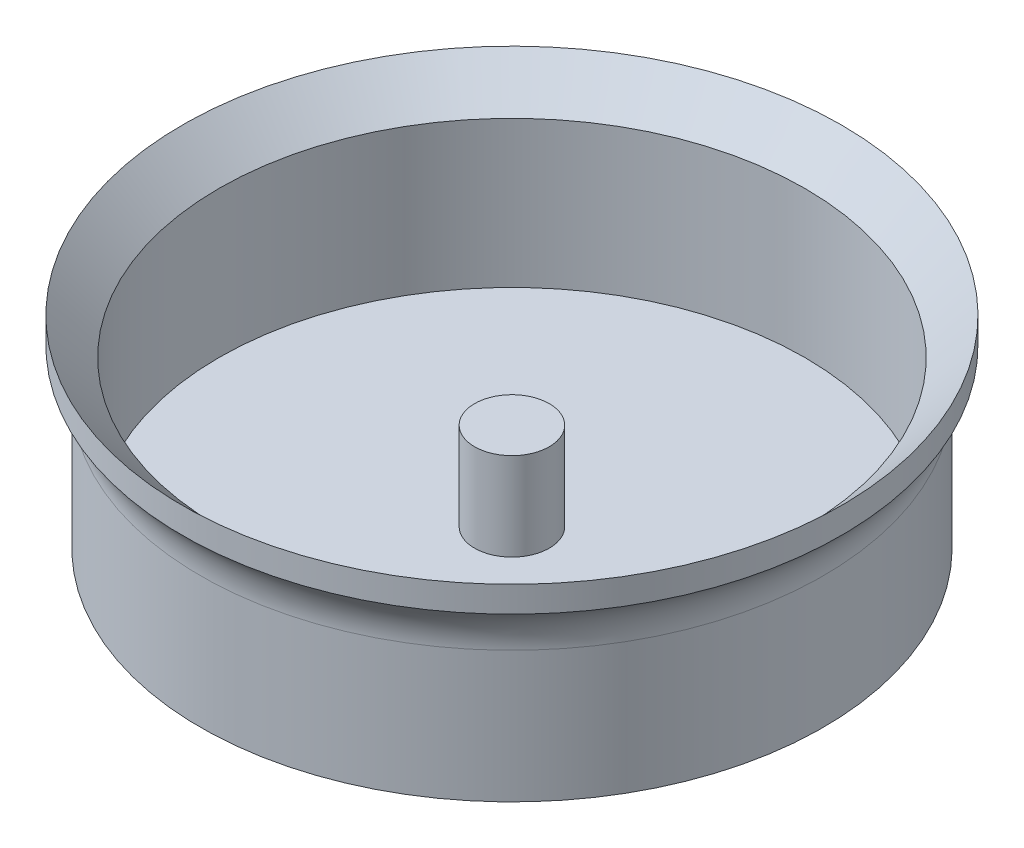
ISO-10303-21;
HEADER;
FILE_DESCRIPTION(('STEP AP214'),'2;1');
FILE_NAME('part.step','',(''),(''),'','','');
FILE_SCHEMA(('AUTOMOTIVE_DESIGN { 1 0 10303 214 1 1 1 1 }'));
ENDSEC;
DATA;
#1=APPLICATION_CONTEXT('core data for automotive mechanical design processes');
#2=APPLICATION_PROTOCOL_DEFINITION('international standard','automotive_design',2000,#1);
#3=PRODUCT_CONTEXT('',#1,'mechanical');
#4=PRODUCT('Part','Part','',(#3));
#5=PRODUCT_RELATED_PRODUCT_CATEGORY('part','',(#4));
#6=PRODUCT_DEFINITION_FORMATION('','',#4);
#7=PRODUCT_DEFINITION_CONTEXT('part definition',#1,'design');
#8=PRODUCT_DEFINITION('design','',#6,#7);
#9=PRODUCT_DEFINITION_SHAPE('','',#8);
#10=(LENGTH_UNIT() NAMED_UNIT(*) SI_UNIT(.MILLI.,.METRE.));
#11=(NAMED_UNIT(*) PLANE_ANGLE_UNIT() SI_UNIT($,.RADIAN.));
#12=(NAMED_UNIT(*) SI_UNIT($,.STERADIAN.) SOLID_ANGLE_UNIT());
#13=UNCERTAINTY_MEASURE_WITH_UNIT(LENGTH_MEASURE(1.E-05),#10,'distance_accuracy_value','');
#14=(GEOMETRIC_REPRESENTATION_CONTEXT(3) GLOBAL_UNCERTAINTY_ASSIGNED_CONTEXT((#13)) GLOBAL_UNIT_ASSIGNED_CONTEXT((#10,
#11,#12)) REPRESENTATION_CONTEXT('',''));
#15=CARTESIAN_POINT('',(0.,0.,0.));
#16=DIRECTION('',(0.,0.,1.));
#17=DIRECTION('',(1.,0.,0.));
#18=AXIS2_PLACEMENT_3D('',#15,#16,#17);
#19=CARTESIAN_POINT('',(0.,0.,-26.9875));
#20=DIRECTION('',(0.,-1.,0.));
#21=DIRECTION('',(0.,0.,-1.));
#22=AXIS2_PLACEMENT_3D('',#19,#20,#21);
#23=PLANE('',#22);
#24=CARTESIAN_POINT('',(0.,0.,0.));
#25=DIRECTION('',(0.,-1.,0.));
#26=DIRECTION('',(0.,0.,-1.));
#27=AXIS2_PLACEMENT_3D('',#24,#25,#26);
#28=CIRCLE('',#27,26.9875);
#29=CARTESIAN_POINT('',(0.,0.,-26.9875));
#30=VERTEX_POINT('',#29);
#31=EDGE_CURVE('E10',#30,#30,#28,.T.);
#32=ORIENTED_EDGE('',*,*,#31,.T.);
#33=EDGE_LOOP('',(#32));
#34=FACE_BOUND('',#33,.T.);
#35=ADVANCED_FACE('F35',(#34),#23,.T.);
#36=CARTESIAN_POINT('',(0.,0.,0.));
#37=DIRECTION('',(0.,-1.,0.));
#38=DIRECTION('',(0.,0.,-1.));
#39=AXIS2_PLACEMENT_3D('',#36,#37,#38);
#40=CYLINDRICAL_SURFACE('',#39,26.9875);
#41=CARTESIAN_POINT('',(0.,11.3848719394654,0.));
#42=DIRECTION('',(0.,-1.,0.));
#43=DIRECTION('',(0.,0.,-1.));
#44=AXIS2_PLACEMENT_3D('',#41,#42,#43);
#45=CIRCLE('',#44,26.9875);
#46=CARTESIAN_POINT('',(0.,11.3848719394654,-26.9875));
#47=VERTEX_POINT('',#46);
#48=EDGE_CURVE('E41',#47,#47,#45,.T.);
#49=ORIENTED_EDGE('',*,*,#48,.T.);
#50=EDGE_LOOP('',(#49));
#51=FACE_BOUND('',#50,.T.);
#52=ORIENTED_EDGE('',*,*,#31,.F.);
#53=EDGE_LOOP('',(#52));
#54=FACE_BOUND('',#53,.T.);
#55=ADVANCED_FACE('F79',(#51,#54),#40,.T.);
#56=CARTESIAN_POINT('',(0.,11.3848719394654,0.));
#57=DIRECTION('',(0.,-1.,0.));
#58=DIRECTION('',(0.,0.,-1.));
#59=AXIS2_PLACEMENT_3D('',#56,#57,#58);
#60=TOROIDAL_SURFACE('',#59,32.4075640302673,5.42006403026727);
#61=CARTESIAN_POINT('',(0.,15.2174359697327,0.));
#62=DIRECTION('',(0.,-1.,0.));
#63=DIRECTION('',(0.,0.,-1.));
#64=AXIS2_PLACEMENT_3D('',#61,#62,#63);
#65=CIRCLE('',#64,28.575);
#66=CARTESIAN_POINT('',(0.,15.2174359697327,-28.575));
#67=VERTEX_POINT('',#66);
#68=EDGE_CURVE('E45',#67,#67,#65,.T.);
#69=ORIENTED_EDGE('',*,*,#68,.T.);
#70=EDGE_LOOP('',(#69));
#71=FACE_BOUND('',#70,.T.);
#72=ORIENTED_EDGE('',*,*,#48,.F.);
#73=EDGE_LOOP('',(#72));
#74=FACE_BOUND('',#73,.T.);
#75=ADVANCED_FACE('F83',(#71,#74),#60,.F.);
#76=CARTESIAN_POINT('',(0.,0.,0.));
#77=DIRECTION('',(0.,-1.,0.));
#78=DIRECTION('',(0.,0.,-1.));
#79=AXIS2_PLACEMENT_3D('',#76,#77,#78);
#80=CYLINDRICAL_SURFACE('',#79,28.575);
#81=CARTESIAN_POINT('',(0.,17.4625,0.));
#82=DIRECTION('',(0.,-1.,0.));
#83=DIRECTION('',(0.,0.,-1.));
#84=AXIS2_PLACEMENT_3D('',#81,#82,#83);
#85=CIRCLE('',#84,28.575);
#86=CARTESIAN_POINT('',(0.,17.4625,-28.575));
#87=VERTEX_POINT('',#86);
#88=EDGE_CURVE('E49',#87,#87,#85,.T.);
#89=ORIENTED_EDGE('',*,*,#88,.T.);
#90=EDGE_LOOP('',(#89));
#91=FACE_BOUND('',#90,.T.);
#92=ORIENTED_EDGE('',*,*,#68,.F.);
#93=EDGE_LOOP('',(#92));
#94=FACE_BOUND('',#93,.T.);
#95=ADVANCED_FACE('F87',(#91,#94),#80,.T.);
#96=CARTESIAN_POINT('',(0.,17.4625,0.));
#97=DIRECTION('',(0.,1.,0.));
#98=DIRECTION('',(0.,0.,1.));
#99=AXIS2_PLACEMENT_3D('',#96,#97,#98);
#100=CONICAL_SURFACE('',#99,28.575,0.78539816339745);
#101=CARTESIAN_POINT('',(0.,14.2875,0.));
#102=DIRECTION('',(0.,-1.,0.));
#103=DIRECTION('',(0.,0.,-1.));
#104=AXIS2_PLACEMENT_3D('',#101,#102,#103);
#105=CIRCLE('',#104,25.4);
#106=CARTESIAN_POINT('',(0.,14.2875,-25.4));
#107=VERTEX_POINT('',#106);
#108=EDGE_CURVE('E54',#107,#107,#105,.T.);
#109=ORIENTED_EDGE('',*,*,#108,.T.);
#110=EDGE_LOOP('',(#109));
#111=FACE_BOUND('',#110,.T.);
#112=ORIENTED_EDGE('',*,*,#88,.F.);
#113=EDGE_LOOP('',(#112));
#114=FACE_BOUND('',#113,.T.);
#115=ADVANCED_FACE('F94',(#111,#114),#100,.F.);
#116=CARTESIAN_POINT('',(0.,0.,0.));
#117=DIRECTION('',(0.,-1.,0.));
#118=DIRECTION('',(0.,0.,-1.));
#119=AXIS2_PLACEMENT_3D('',#116,#117,#118);
#120=CYLINDRICAL_SURFACE('',#119,25.4);
#121=CARTESIAN_POINT('',(0.,1.5875,0.));
#122=DIRECTION('',(0.,-1.,0.));
#123=DIRECTION('',(0.,0.,-1.));
#124=AXIS2_PLACEMENT_3D('',#121,#122,#123);
#125=CIRCLE('',#124,25.4);
#126=CARTESIAN_POINT('',(0.,1.5875,-25.4));
#127=VERTEX_POINT('',#126);
#128=EDGE_CURVE('E57',#127,#127,#125,.T.);
#129=ORIENTED_EDGE('',*,*,#128,.T.);
#130=EDGE_LOOP('',(#129));
#131=FACE_BOUND('',#130,.T.);
#132=ORIENTED_EDGE('',*,*,#108,.F.);
#133=EDGE_LOOP('',(#132));
#134=FACE_BOUND('',#133,.T.);
#135=ADVANCED_FACE('F98',(#131,#134),#120,.F.);
#136=CARTESIAN_POINT('',(0.,1.5875,-3.2385));
#137=DIRECTION('',(0.,1.,0.));
#138=DIRECTION('',(0.,0.,1.));
#139=AXIS2_PLACEMENT_3D('',#136,#137,#138);
#140=PLANE('',#139);
#141=CARTESIAN_POINT('',(0.,1.5875,0.));
#142=DIRECTION('',(0.,-1.,0.));
#143=DIRECTION('',(0.,0.,-1.));
#144=AXIS2_PLACEMENT_3D('',#141,#142,#143);
#145=CIRCLE('',#144,3.2385);
#146=CARTESIAN_POINT('',(0.,1.5875,-3.2385));
#147=VERTEX_POINT('',#146);
#148=EDGE_CURVE('E60',#147,#147,#145,.T.);
#149=ORIENTED_EDGE('',*,*,#148,.T.);
#150=EDGE_LOOP('',(#149));
#151=FACE_BOUND('',#150,.T.);
#152=ORIENTED_EDGE('',*,*,#128,.F.);
#153=EDGE_LOOP('',(#152));
#154=FACE_BOUND('',#153,.T.);
#155=ADVANCED_FACE('F76',(#151,#154),#140,.T.);
#156=CARTESIAN_POINT('',(0.,0.,0.));
#157=DIRECTION('',(0.,-1.,0.));
#158=DIRECTION('',(0.,0.,-1.));
#159=AXIS2_PLACEMENT_3D('',#156,#157,#158);
#160=CYLINDRICAL_SURFACE('',#159,3.2385);
#161=CARTESIAN_POINT('',(0.,9.2075,0.));
#162=DIRECTION('',(0.,-1.,0.));
#163=DIRECTION('',(0.,0.,-1.));
#164=AXIS2_PLACEMENT_3D('',#161,#162,#163);
#165=CIRCLE('',#164,3.2385);
#166=CARTESIAN_POINT('',(0.,9.2075,-3.2385));
#167=VERTEX_POINT('',#166);
#168=EDGE_CURVE('E63',#167,#167,#165,.T.);
#169=ORIENTED_EDGE('',*,*,#168,.T.);
#170=EDGE_LOOP('',(#169));
#171=FACE_BOUND('',#170,.T.);
#172=ORIENTED_EDGE('',*,*,#148,.F.);
#173=EDGE_LOOP('',(#172));
#174=FACE_BOUND('',#173,.T.);
#175=ADVANCED_FACE('F67',(#171,#174),#160,.T.);
#176=CARTESIAN_POINT('',(0.,9.2075,0.));
#177=DIRECTION('',(0.,1.,0.));
#178=DIRECTION('',(0.,0.,1.));
#179=AXIS2_PLACEMENT_3D('',#176,#177,#178);
#180=PLANE('',#179);
#181=ORIENTED_EDGE('',*,*,#168,.F.);
#182=EDGE_LOOP('',(#181));
#183=FACE_BOUND('',#182,.T.);
#184=ADVANCED_FACE('F70',(#183),#180,.T.);
#185=CLOSED_SHELL('',(#35,#55,#75,#95,#115,#135,#155,#175,#184));
#186=MANIFOLD_SOLID_BREP('B2',#185);
#187=ADVANCED_BREP_SHAPE_REPRESENTATION('',(#18,#186),#14);
#188=SHAPE_DEFINITION_REPRESENTATION(#9,#187);
ENDSEC;
END-ISO-10303-21;
